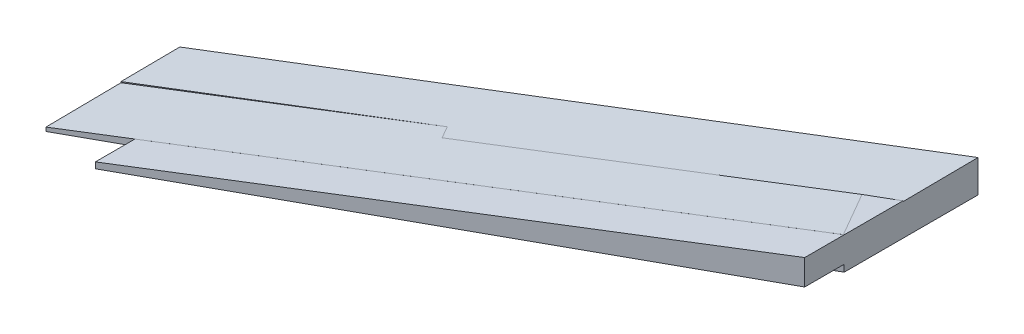
ISO-10303-21;
HEADER;
FILE_DESCRIPTION(('STEP AP214'),'2;1');
FILE_NAME('part.step','',(''),(''),'','','');
FILE_SCHEMA(('AUTOMOTIVE_DESIGN { 1 0 10303 214 1 1 1 1 }'));
ENDSEC;
DATA;
#1=APPLICATION_CONTEXT('core data for automotive mechanical design processes');
#2=APPLICATION_PROTOCOL_DEFINITION('international standard','automotive_design',2000,#1);
#3=PRODUCT_CONTEXT('',#1,'mechanical');
#4=PRODUCT('Part','Part','',(#3));
#5=PRODUCT_RELATED_PRODUCT_CATEGORY('part','',(#4));
#6=PRODUCT_DEFINITION_FORMATION('','',#4);
#7=PRODUCT_DEFINITION_CONTEXT('part definition',#1,'design');
#8=PRODUCT_DEFINITION('design','',#6,#7);
#9=PRODUCT_DEFINITION_SHAPE('','',#8);
#10=(LENGTH_UNIT() NAMED_UNIT(*) SI_UNIT(.MILLI.,.METRE.));
#11=(NAMED_UNIT(*) PLANE_ANGLE_UNIT() SI_UNIT($,.RADIAN.));
#12=(NAMED_UNIT(*) SI_UNIT($,.STERADIAN.) SOLID_ANGLE_UNIT());
#13=UNCERTAINTY_MEASURE_WITH_UNIT(LENGTH_MEASURE(1.E-05),#10,'distance_accuracy_value','');
#14=(GEOMETRIC_REPRESENTATION_CONTEXT(3) GLOBAL_UNCERTAINTY_ASSIGNED_CONTEXT((#13)) GLOBAL_UNIT_ASSIGNED_CONTEXT((#10,
#11,#12)) REPRESENTATION_CONTEXT('',''));
#15=CARTESIAN_POINT('',(0.,0.,0.));
#16=DIRECTION('',(0.,0.,1.));
#17=DIRECTION('',(1.,0.,0.));
#18=AXIS2_PLACEMENT_3D('',#15,#16,#17);
#19=CARTESIAN_POINT('',(-17157.6952997773,389.318894009088,14193.2592132526));
#20=DIRECTION('',(0.500000000000001,0.,0.866025403784438));
#21=DIRECTION('',(0.866025403784438,0.,-0.500000000000001));
#22=AXIS2_PLACEMENT_3D('',#19,#20,#21);
#23=PLANE('',#22);
#24=DIRECTION('',(0.865449530647156,0.036462033269615,-0.499667519489173));
#25=VECTOR('',#24,1.);
#26=CARTESIAN_POINT('',(-17116.5165476552,-913.886239330469,14169.48464963));
#27=LINE('',#26,#25);
#28=CARTESIAN_POINT('',(-4259.50817269094,-372.210901237541,6746.48740337114));
#29=VERTEX_POINT('',#28);
#30=CARTESIAN_POINT('',(-1123.39122511417,-240.083958613352,4935.84943947754));
#31=VERTEX_POINT('',#30);
#32=EDGE_CURVE('E220',#29,#31,#27,.T.);
#33=ORIENTED_EDGE('',*,*,#32,.F.);
#34=DIRECTION('',(0.866025403784438,0.,-0.500000000000001));
#35=VECTOR('',#34,1.);
#36=CARTESIAN_POINT('',(-17157.6952997773,-372.210901237541,14193.2592132526));
#37=LINE('',#36,#35);
#38=CARTESIAN_POINT('',(0.,-372.210901237541,4287.25921325261));
#39=VERTEX_POINT('',#38);
#40=EDGE_CURVE('E306',#29,#39,#37,.T.);
#41=ORIENTED_EDGE('',*,*,#40,.T.);
#42=DIRECTION('',(0.,-1.,0.));
#43=VECTOR('',#42,1.);
#44=CARTESIAN_POINT('',(0.,389.318894009088,4287.25921325261));
#45=LINE('',#44,#43);
#46=CARTESIAN_POINT('',(0.,-209.67853273297,4287.25921325261));
#47=VERTEX_POINT('',#46);
#48=EDGE_CURVE('E296',#47,#39,#45,.T.);
#49=ORIENTED_EDGE('',*,*,#48,.F.);
#50=DIRECTION('',(0.865787597616116,0.0234331905385812,-0.499862702544706));
#51=VECTOR('',#50,1.);
#52=CARTESIAN_POINT('',(-10555.6823901357,-495.375991779352,10381.5852826777));
#53=LINE('',#52,#51);
#54=EDGE_CURVE('E102',#31,#47,#53,.T.);
#55=ORIENTED_EDGE('',*,*,#54,.F.);
#56=EDGE_LOOP('',(#33,#41,#49,#55));
#57=FACE_BOUND('',#56,.T.);
#58=ADVANCED_FACE('F79',(#57),#23,.T.);
#59=CARTESIAN_POINT('',(-17157.6952997773,389.318894009089,11053.2235687628));
#60=DIRECTION('',(-0.500000000000001,0.,-0.866025403784438));
#61=DIRECTION('',(-0.866025403784438,0.,0.500000000000001));
#62=AXIS2_PLACEMENT_3D('',#59,#60,#61);
#63=PLANE('',#62);
#64=DIRECTION('',(0.865865507815104,-0.0192153541415936,-0.499907684019064));
#65=VECTOR('',#64,1.);
#66=CARTESIAN_POINT('',(-17157.6952997773,-8.55399638577419,11053.2235687628));
#67=LINE('',#66,#65);
#68=CARTESIAN_POINT('',(-11878.4044383073,-125.712426423717,8005.22356876278));
#69=VERTEX_POINT('',#68);
#70=CARTESIAN_POINT('',(-770.905430088806,-372.21090123754,1592.30602634428));
#71=VERTEX_POINT('',#70);
#72=EDGE_CURVE('E288',#69,#71,#67,.T.);
#73=ORIENTED_EDGE('',*,*,#72,.F.);
#74=DIRECTION('',(0.,-1.,0.));
#75=VECTOR('',#74,1.);
#76=CARTESIAN_POINT('',(-11878.4044383073,389.318894009089,8005.22356876278));
#77=LINE('',#76,#75);
#78=CARTESIAN_POINT('',(-11878.4044383073,125.712426423717,8005.22356876278));
#79=VERTEX_POINT('',#78);
#80=EDGE_CURVE('E248',#79,#69,#77,.T.);
#81=ORIENTED_EDGE('',*,*,#80,.F.);
#82=DIRECTION('',(-0.865865507815104,-0.0192153541415936,0.499907684019064));
#83=VECTOR('',#82,1.);
#84=CARTESIAN_POINT('',(-17157.6952997773,8.5539963857742,11053.2235687628));
#85=LINE('',#84,#83);
#86=CARTESIAN_POINT('',(1.11022302462516E-12,389.318894009089,1147.22356876276));
#87=VERTEX_POINT('',#86);
#88=EDGE_CURVE('E282',#87,#79,#85,.T.);
#89=ORIENTED_EDGE('',*,*,#88,.F.);
#90=DIRECTION('',(0.,1.,0.));
#91=VECTOR('',#90,1.);
#92=CARTESIAN_POINT('',(0.,389.318894009089,1147.22356876276));
#93=LINE('',#92,#91);
#94=CARTESIAN_POINT('',(0.,-372.21090123754,1147.22356876276));
#95=VERTEX_POINT('',#94);
#96=EDGE_CURVE('E285',#95,#87,#93,.T.);
#97=ORIENTED_EDGE('',*,*,#96,.F.);
#98=DIRECTION('',(0.866025403784438,0.,-0.500000000000001));
#99=VECTOR('',#98,1.);
#100=CARTESIAN_POINT('',(-17157.6952997773,-372.21090123754,11053.2235687628));
#101=LINE('',#100,#99);
#102=EDGE_CURVE('E303',#71,#95,#101,.T.);
#103=ORIENTED_EDGE('',*,*,#102,.F.);
#104=EDGE_LOOP('',(#73,#81,#89,#97,#103));
#105=FACE_BOUND('',#104,.T.);
#106=ADVANCED_FACE('F81',(#105),#63,.T.);
#107=DIRECTION('',(-0.865938611610236,0.0141572559740367,0.499949890514862));
#108=VECTOR('',#107,1.);
#109=CARTESIAN_POINT('',(-17161.680228594,64.3308941444504,14195.5599129777));
#110=LINE('',#109,#108);
#111=CARTESIAN_POINT('',(-10555.6823901357,-43.6707599093858,10381.5852826777));
#112=VERTEX_POINT('',#111);
#113=CARTESIAN_POINT('',(-11878.4044383073,-22.045538020219,11145.2592132526));
#114=VERTEX_POINT('',#113);
#115=EDGE_CURVE('E210',#112,#114,#110,.T.);
#116=ORIENTED_EDGE('',*,*,#115,.F.);
#117=DIRECTION('',(0.,1.,0.));
#118=VECTOR('',#117,1.);
#119=CARTESIAN_POINT('',(-10555.6823901357,-495.375991779352,10381.5852826777));
#120=LINE('',#119,#118);
#121=CARTESIAN_POINT('',(-10555.6823901357,103.621434962706,10381.5852826777));
#122=VERTEX_POINT('',#121);
#123=EDGE_CURVE('E234',#112,#122,#120,.T.);
#124=ORIENTED_EDGE('',*,*,#123,.T.);
#125=DIRECTION('',(0.865787597616116,0.0234331905385812,-0.499862702544706));
#126=VECTOR('',#125,1.);
#127=CARTESIAN_POINT('',(-10555.6823901357,103.621434962706,10381.5852826777));
#128=LINE('',#127,#126);
#129=CARTESIAN_POINT('',(0.,389.318894009088,4287.25921325261));
#130=VERTEX_POINT('',#129);
#131=EDGE_CURVE('E249',#122,#130,#128,.T.);
#132=ORIENTED_EDGE('',*,*,#131,.T.);
#133=DIRECTION('',(0.866025403784438,0.,-0.500000000000001));
#134=VECTOR('',#133,1.);
#135=CARTESIAN_POINT('',(-17157.6952997773,389.318894009088,14193.2592132526));
#136=LINE('',#135,#134);
#137=CARTESIAN_POINT('',(-12.6233714239905,389.318894009088,4294.54732014233));
#138=VERTEX_POINT('',#137);
#139=EDGE_CURVE('E302',#138,#130,#136,.T.);
#140=ORIENTED_EDGE('',*,*,#139,.F.);
#141=DIRECTION('',(0.865787597616116,0.0234331905385812,-0.499862702544706));
#142=VECTOR('',#141,1.);
#143=CARTESIAN_POINT('',(-15553.2970278185,-31.3010916443354,13266.9594390499));
#144=LINE('',#143,#142);
#145=CARTESIAN_POINT('',(-11878.4044383073,68.1626319016542,11145.2592132526));
#146=VERTEX_POINT('',#145);
#147=EDGE_CURVE('E263',#146,#138,#144,.T.);
#148=ORIENTED_EDGE('',*,*,#147,.F.);
#149=DIRECTION('',(0.,1.,0.));
#150=VECTOR('',#149,1.);
#151=CARTESIAN_POINT('',(-11878.4044383073,389.318894009089,11145.2592132526));
#152=LINE('',#151,#150);
#153=EDGE_CURVE('E254',#114,#146,#152,.T.);
#154=ORIENTED_EDGE('',*,*,#153,.F.);
#155=EDGE_LOOP('',(#116,#124,#132,#140,#148,#154));
#156=FACE_BOUND('',#155,.T.);
#157=ADVANCED_FACE('F329',(#156),#23,.T.);
#158=CARTESIAN_POINT('',(-16395.6952997773,8.5539963857742,12373.0462841303));
#159=DIRECTION('',(0.0166409848293346,-0.999815368038126,-0.00960767707079685));
#160=DIRECTION('',(0.999861516440926,0.0166417529260207,0.));
#161=AXIS2_PLACEMENT_3D('',#158,#159,#160);
#162=PLANE('',#161);
#163=DIRECTION('',(0.,0.00960900763753258,-0.999953832420388));
#164=VECTOR('',#163,1.);
#165=CARTESIAN_POINT('',(-11878.4044383073,83.7331046735021,12373.7687141088));
#166=LINE('',#165,#164);
#167=CARTESIAN_POINT('',(-11878.4044383073,112.4487696523,9385.49559276265));
#168=VERTEX_POINT('',#167);
#169=EDGE_CURVE('E258',#168,#79,#166,.T.);
#170=ORIENTED_EDGE('',*,*,#169,.F.);
#171=DIRECTION('',(0.865865507815105,0.0192153541415937,-0.499907684019064));
#172=VECTOR('',#171,1.);
#173=CARTESIAN_POINT('',(-16560.0199813189,8.5539963857742,12088.4275867627));
#174=LINE('',#173,#172);
#175=CARTESIAN_POINT('',(-7023.33152303197,220.192922304478,6582.41793819314));
#176=VERTEX_POINT('',#175);
#177=EDGE_CURVE('E276',#168,#176,#174,.T.);
#178=ORIENTED_EDGE('',*,*,#177,.T.);
#179=DIRECTION('',(0.500000000000002,0.,0.866025403784438));
#180=VECTOR('',#179,1.);
#181=CARTESIAN_POINT('',(-6859.00684149535,220.192922304356,6867.03663556357));
#182=LINE('',#181,#180);
#183=CARTESIAN_POINT('',(-6859.00684154281,220.192922303187,6867.03663559098));
#184=VERTEX_POINT('',#183);
#185=EDGE_CURVE('E273',#176,#184,#182,.T.);
#186=ORIENTED_EDGE('',*,*,#185,.T.);
#187=DIRECTION('',(-0.865865507815104,-0.0192153541415936,0.499907684019064));
#188=VECTOR('',#187,1.);
#189=CARTESIAN_POINT('',(-16395.6952997773,8.5539963857742,12373.0462841303));
#190=LINE('',#189,#188);
#191=CARTESIAN_POINT('',(0.,372.408531229028,2906.98718925274));
#192=VERTEX_POINT('',#191);
#193=EDGE_CURVE('E281',#192,#184,#190,.T.);
#194=ORIENTED_EDGE('',*,*,#193,.F.);
#195=DIRECTION('',(0.,-0.00960900763753258,0.999953832420388));
#196=VECTOR('',#195,1.);
#197=CARTESIAN_POINT('',(0.,400.306118114407,3.846722140163));
#198=LINE('',#197,#196);
#199=EDGE_CURVE('E311',#87,#192,#198,.T.);
#200=ORIENTED_EDGE('',*,*,#199,.F.);
#201=ORIENTED_EDGE('',*,*,#88,.T.);
#202=EDGE_LOOP('',(#170,#178,#186,#194,#200,#201));
#203=FACE_BOUND('',#202,.T.);
#204=ADVANCED_FACE('F351',(#203),#162,.F.);
#205=CARTESIAN_POINT('',(-16395.6952997773,-8.55399638577419,12373.0462841303));
#206=DIRECTION('',(0.0166409848293346,0.999815368038126,-0.00960767707079685));
#207=DIRECTION('',(-0.999861516440926,0.0166417529260207,0.));
#208=AXIS2_PLACEMENT_3D('',#205,#206,#207);
#209=PLANE('',#208);
#210=DIRECTION('',(0.865865507815104,-0.0192153541415936,-0.499907684019064));
#211=VECTOR('',#210,1.);
#212=CARTESIAN_POINT('',(-16395.6952997773,-8.55399638577419,12373.0462841303));
#213=LINE('',#212,#211);
#214=CARTESIAN_POINT('',(-3184.47452777852,-301.738426860844,4745.54441509318));
#215=VERTEX_POINT('',#214);
#216=CARTESIAN_POINT('',(-8.90543008879696,-372.21090123754,2912.12874171176));
#217=VERTEX_POINT('',#216);
#218=EDGE_CURVE('E278',#215,#217,#213,.T.);
#219=ORIENTED_EDGE('',*,*,#218,.F.);
#220=DIRECTION('',(-0.500000000000001,0.,-0.866025403784438));
#221=VECTOR('',#220,1.);
#222=CARTESIAN_POINT('',(-3184.47452777693,-301.738426860828,4745.54441509226));
#223=LINE('',#222,#221);
#224=CARTESIAN_POINT('',(-3251.90008959657,-301.738426860809,4628.75991628716));
#225=VERTEX_POINT('',#224);
#226=EDGE_CURVE('E227',#215,#225,#223,.T.);
#227=ORIENTED_EDGE('',*,*,#226,.T.);
#228=DIRECTION('',(0.865865507815105,-0.0192153541415936,-0.499907684019064));
#229=VECTOR('',#228,1.);
#230=CARTESIAN_POINT('',(-16463.1208615989,-8.55399638577419,12256.2617853263));
#231=LINE('',#230,#229);
#232=CARTESIAN_POINT('',(-11878.4044383073,-110.298376912756,9609.27452418082));
#233=VERTEX_POINT('',#232);
#234=EDGE_CURVE('E204',#233,#225,#231,.T.);
#235=ORIENTED_EDGE('',*,*,#234,.F.);
#236=DIRECTION('',(0.,0.00960900763753258,0.999953832420388));
#237=VECTOR('',#236,1.);
#238=CARTESIAN_POINT('',(-11878.4044383073,-83.7331046735021,12373.7687141088));
#239=LINE('',#238,#237);
#240=EDGE_CURVE('E260',#69,#233,#239,.T.);
#241=ORIENTED_EDGE('',*,*,#240,.F.);
#242=ORIENTED_EDGE('',*,*,#72,.T.);
#243=DIRECTION('',(0.500000000000008,0.,0.866025403784434));
#244=VECTOR('',#243,1.);
#245=CARTESIAN_POINT('',(-770.905430088867,-372.21090123754,1592.30602634415));
#246=LINE('',#245,#244);
#247=EDGE_CURVE('E317',#71,#217,#246,.T.);
#248=ORIENTED_EDGE('',*,*,#247,.T.);
#249=EDGE_LOOP('',(#219,#227,#235,#241,#242,#248));
#250=FACE_BOUND('',#249,.T.);
#251=ADVANCED_FACE('F373',(#250),#209,.F.);
#252=CARTESIAN_POINT('',(1258.7623771844,0.,2180.24039193955));
#253=DIRECTION('',(0.500000000000001,0.,0.866025403784438));
#254=DIRECTION('',(0.866025403784438,0.,-0.500000000000001));
#255=AXIS2_PLACEMENT_3D('',#252,#253,#254);
#256=PLANE('',#255);
#257=DIRECTION('',(-0.866025403784438,0.,0.500000000000001));
#258=VECTOR('',#257,1.);
#259=CARTESIAN_POINT('',(-16395.6952997773,-372.21090123754,12373.0462841303));
#260=LINE('',#259,#258);
#261=CARTESIAN_POINT('',(-4857.18349114936,-372.21090123754,5711.28338537124));
#262=VERTEX_POINT('',#261);
#263=EDGE_CURVE('E314',#217,#262,#260,.T.);
#264=ORIENTED_EDGE('',*,*,#263,.T.);
#265=DIRECTION('',(0.865449530647156,0.036462033269615,-0.499667519489173));
#266=VECTOR('',#265,1.);
#267=CARTESIAN_POINT('',(1262.37685591903,-114.3892662736,2178.15357166914));
#268=LINE('',#267,#266);
#269=EDGE_CURVE('E224',#262,#215,#268,.T.);
#270=ORIENTED_EDGE('',*,*,#269,.T.);
#271=ORIENTED_EDGE('',*,*,#218,.T.);
#272=EDGE_LOOP('',(#264,#270,#271));
#273=FACE_BOUND('',#272,.T.);
#274=ADVANCED_FACE('F365',(#273),#256,.F.);
#275=CARTESIAN_POINT('',(1094.43769564283,0.,1895.62169457197));
#276=DIRECTION('',(-0.500000000000001,0.,-0.866025403784438));
#277=DIRECTION('',(-0.866025403784438,0.,0.500000000000001));
#278=AXIS2_PLACEMENT_3D('',#275,#276,#277);
#279=PLANE('',#278);
#280=DIRECTION('',(0.,1.,0.));
#281=VECTOR('',#280,1.);
#282=CARTESIAN_POINT('',(-11878.4044383073,0.,9385.49559276265));
#283=LINE('',#282,#281);
#284=CARTESIAN_POINT('',(-11878.4044383073,88.7867332858325,9385.49559276265));
#285=VERTEX_POINT('',#284);
#286=EDGE_CURVE('E256',#285,#168,#283,.T.);
#287=ORIENTED_EDGE('',*,*,#286,.F.);
#288=DIRECTION('',(0.865787597616116,0.0234331905385812,-0.499862702544706));
#289=VECTOR('',#288,1.);
#290=CARTESIAN_POINT('',(-16315.2970278185,-31.3010916443354,11947.1367236824));
#291=LINE('',#290,#289);
#292=EDGE_CURVE('E264',#285,#176,#291,.T.);
#293=ORIENTED_EDGE('',*,*,#292,.T.);
#294=ORIENTED_EDGE('',*,*,#177,.F.);
#295=EDGE_LOOP('',(#287,#293,#294));
#296=FACE_BOUND('',#295,.T.);
#297=ADVANCED_FACE('F363',(#296),#279,.F.);
#298=CARTESIAN_POINT('',(-16315.2970278185,-31.3010916443354,11947.1367236824));
#299=DIRECTION('',(0.0202937382981324,-0.999725405089409,-0.0117165952692906));
#300=DIRECTION('',(0.999794032609656,0.0202951313896042,0.));
#301=AXIS2_PLACEMENT_3D('',#298,#299,#300);
#302=PLANE('',#301);
#303=DIRECTION('',(0.,0.011719008671536,-0.999931330060098));
#304=VECTOR('',#303,1.);
#305=CARTESIAN_POINT('',(-11878.4044383073,58.75240784242,11948.1921338987));
#306=LINE('',#305,#304);
#307=EDGE_CURVE('E320',#146,#285,#306,.T.);
#308=ORIENTED_EDGE('',*,*,#307,.F.);
#309=ORIENTED_EDGE('',*,*,#147,.T.);
#310=DIRECTION('',(0.500000000000001,0.,0.866025403784438));
#311=VECTOR('',#310,1.);
#312=CARTESIAN_POINT('',(-774.623371423993,389.318894009088,2974.72460477485));
#313=LINE('',#312,#311);
#314=CARTESIAN_POINT('',(-610.298689882333,389.31889400909,3259.34330214238));
#315=VERTEX_POINT('',#314);
#316=EDGE_CURVE('E267',#315,#138,#313,.T.);
#317=ORIENTED_EDGE('',*,*,#316,.F.);
#318=DIRECTION('',(-0.865787597616116,-0.0234331905385812,0.499862702544706));
#319=VECTOR('',#318,1.);
#320=CARTESIAN_POINT('',(1249.83748255511,439.664874335504,2185.39318225626));
#321=LINE('',#320,#319);
#322=EDGE_CURVE('E271',#315,#184,#321,.T.);
#323=ORIENTED_EDGE('',*,*,#322,.T.);
#324=ORIENTED_EDGE('',*,*,#185,.F.);
#325=ORIENTED_EDGE('',*,*,#292,.F.);
#326=EDGE_LOOP('',(#308,#309,#317,#323,#324,#325));
#327=FACE_BOUND('',#326,.T.);
#328=ADVANCED_FACE('F358',(#327),#302,.F.);
#329=CARTESIAN_POINT('',(-17157.6952997773,-372.21090123754,11053.2235687628));
#330=DIRECTION('',(0.,-1.,0.));
#331=DIRECTION('',(0.,0.,-1.));
#332=AXIS2_PLACEMENT_3D('',#329,#330,#331);
#333=PLANE('',#332);
#334=DIRECTION('',(0.499999999999998,0.,0.86602540378444));
#335=VECTOR('',#334,1.);
#336=CARTESIAN_POINT('',(-5619.18349114933,-372.21090123754,4391.4606700038));
#337=LINE('',#336,#335);
#338=EDGE_CURVE('E222',#262,#29,#337,.T.);
#339=ORIENTED_EDGE('',*,*,#338,.F.);
#340=ORIENTED_EDGE('',*,*,#263,.F.);
#341=ORIENTED_EDGE('',*,*,#247,.F.);
#342=ORIENTED_EDGE('',*,*,#102,.T.);
#343=DIRECTION('',(0.,0.,-1.));
#344=VECTOR('',#343,1.);
#345=CARTESIAN_POINT('',(0.,-372.21090123754,1147.22356876276));
#346=LINE('',#345,#344);
#347=EDGE_CURVE('E299',#39,#95,#346,.T.);
#348=ORIENTED_EDGE('',*,*,#347,.F.);
#349=ORIENTED_EDGE('',*,*,#40,.F.);
#350=EDGE_LOOP('',(#339,#340,#341,#342,#348,#349));
#351=FACE_BOUND('',#350,.T.);
#352=ADVANCED_FACE('F371',(#351),#333,.T.);
#353=CARTESIAN_POINT('',(-17157.6952997773,389.318894009089,11053.2235687628));
#354=DIRECTION('',(0.,1.,0.));
#355=DIRECTION('',(0.,0.,1.));
#356=AXIS2_PLACEMENT_3D('',#353,#354,#355);
#357=PLANE('',#356);
#358=ORIENTED_EDGE('',*,*,#316,.T.);
#359=ORIENTED_EDGE('',*,*,#139,.T.);
#360=DIRECTION('',(0.,0.,1.));
#361=VECTOR('',#360,1.);
#362=CARTESIAN_POINT('',(0.,389.318894009089,1147.22356876276));
#363=LINE('',#362,#361);
#364=CARTESIAN_POINT('',(0.,389.318894009088,2906.98718925274));
#365=VERTEX_POINT('',#364);
#366=EDGE_CURVE('E293',#365,#130,#363,.T.);
#367=ORIENTED_EDGE('',*,*,#366,.F.);
#368=DIRECTION('',(0.866025403784438,0.,-0.500000000000001));
#369=VECTOR('',#368,1.);
#370=CARTESIAN_POINT('',(762.000000000003,389.318894009089,2467.04628413024));
#371=LINE('',#370,#369);
#372=EDGE_CURVE('E279',#315,#365,#371,.T.);
#373=ORIENTED_EDGE('',*,*,#372,.F.);
#374=EDGE_LOOP('',(#358,#359,#367,#373));
#375=FACE_BOUND('',#374,.T.);
#376=ADVANCED_FACE('F340',(#375),#357,.T.);
#377=CARTESIAN_POINT('',(0.,0.,0.));
#378=DIRECTION('',(-1.,0.,0.));
#379=DIRECTION('',(0.,0.,1.));
#380=AXIS2_PLACEMENT_3D('',#377,#378,#379);
#381=PLANE('',#380);
#382=ORIENTED_EDGE('',*,*,#96,.T.);
#383=ORIENTED_EDGE('',*,*,#199,.T.);
#384=DIRECTION('',(0.,-1.,0.));
#385=VECTOR('',#384,1.);
#386=CARTESIAN_POINT('',(0.,0.,2906.98718925274));
#387=LINE('',#386,#385);
#388=EDGE_CURVE('E305',#365,#192,#387,.T.);
#389=ORIENTED_EDGE('',*,*,#388,.F.);
#390=ORIENTED_EDGE('',*,*,#366,.T.);
#391=DIRECTION('',(0.,0.,1.));
#392=VECTOR('',#391,1.);
#393=CARTESIAN_POINT('',(0.,389.318894009088,5214.94359286677));
#394=LINE('',#393,#392);
#395=CARTESIAN_POINT('',(0.,389.318894009088,5214.94359286677));
#396=VERTEX_POINT('',#395);
#397=EDGE_CURVE('E235',#130,#396,#394,.T.);
#398=ORIENTED_EDGE('',*,*,#397,.T.);
#399=DIRECTION('',(0.,-1.,0.));
#400=VECTOR('',#399,1.);
#401=CARTESIAN_POINT('',(0.,-209.67853273297,5214.94359286677));
#402=LINE('',#401,#400);
#403=CARTESIAN_POINT('',(1.77635683940025E-12,-209.67853273297,5214.94359286677));
#404=VERTEX_POINT('',#403);
#405=EDGE_CURVE('E230',#396,#404,#402,.T.);
#406=ORIENTED_EDGE('',*,*,#405,.T.);
#407=DIRECTION('',(0.,0.,-1.));
#408=VECTOR('',#407,1.);
#409=CARTESIAN_POINT('',(0.,-209.67853273297,5214.94359286677));
#410=LINE('',#409,#408);
#411=EDGE_CURVE('E242',#404,#47,#410,.T.);
#412=ORIENTED_EDGE('',*,*,#411,.T.);
#413=ORIENTED_EDGE('',*,*,#48,.T.);
#414=ORIENTED_EDGE('',*,*,#347,.T.);
#415=EDGE_LOOP('',(#382,#383,#389,#390,#398,#406,#412,#413,#414));
#416=FACE_BOUND('',#415,.T.);
#417=ADVANCED_FACE('F344',(#416),#381,.F.);
#418=CARTESIAN_POINT('',(1258.7623771844,0.,2180.24039193955));
#419=DIRECTION('',(-0.500000000000001,0.,-0.866025403784438));
#420=DIRECTION('',(-0.866025403784438,0.,0.500000000000001));
#421=AXIS2_PLACEMENT_3D('',#418,#419,#420);
#422=PLANE('',#421);
#423=ORIENTED_EDGE('',*,*,#322,.F.);
#424=ORIENTED_EDGE('',*,*,#372,.T.);
#425=ORIENTED_EDGE('',*,*,#388,.T.);
#426=ORIENTED_EDGE('',*,*,#193,.T.);
#427=EDGE_LOOP('',(#423,#424,#425,#426));
#428=FACE_BOUND('',#427,.T.);
#429=ADVANCED_FACE('F348',(#428),#422,.T.);
#430=CARTESIAN_POINT('',(-11878.4044383073,0.,-3048.00000000001));
#431=DIRECTION('',(-1.,0.,0.));
#432=DIRECTION('',(0.,0.,1.));
#433=AXIS2_PLACEMENT_3D('',#430,#431,#432);
#434=PLANE('',#433);
#435=DIRECTION('',(0.,-0.00707916007995231,-0.99997494243234));
#436=VECTOR('',#435,1.);
#437=CARTESIAN_POINT('',(-11878.4044383073,-122.518269552774,-3047.13265182349));
#438=LINE('',#437,#436);
#439=CARTESIAN_POINT('',(-11878.4044383073,-32.9192919843398,9609.27452418082));
#440=VERTEX_POINT('',#439);
#441=EDGE_CURVE('E214',#114,#440,#438,.T.);
#442=ORIENTED_EDGE('',*,*,#441,.F.);
#443=ORIENTED_EDGE('',*,*,#153,.T.);
#444=ORIENTED_EDGE('',*,*,#307,.T.);
#445=ORIENTED_EDGE('',*,*,#286,.T.);
#446=ORIENTED_EDGE('',*,*,#169,.T.);
#447=ORIENTED_EDGE('',*,*,#80,.T.);
#448=ORIENTED_EDGE('',*,*,#240,.T.);
#449=DIRECTION('',(0.,1.,0.));
#450=VECTOR('',#449,1.);
#451=CARTESIAN_POINT('',(-11878.4044383073,2.48329556207132E-11,9609.27452418082));
#452=LINE('',#451,#450);
#453=EDGE_CURVE('E13',#233,#440,#452,.T.);
#454=ORIENTED_EDGE('',*,*,#453,.T.);
#455=EDGE_LOOP('',(#442,#443,#444,#445,#446,#447,#448,#454));
#456=FACE_BOUND('',#455,.T.);
#457=ADVANCED_FACE('F361',(#456),#434,.T.);
#458=CARTESIAN_POINT('',(-10555.6823901357,-495.375991779352,11309.2696622918));
#459=DIRECTION('',(0.500000000000001,0.,0.866025403784438));
#460=DIRECTION('',(0.866025403784438,0.,-0.500000000000001));
#461=AXIS2_PLACEMENT_3D('',#458,#459,#460);
#462=PLANE('',#461);
#463=DIRECTION('',(-0.865938611610236,0.0141572559740367,0.499949890514862));
#464=VECTOR('',#463,1.);
#465=CARTESIAN_POINT('',(1.77635683940025E-12,-209.67853273297,5214.94359286677));
#466=LINE('',#465,#464);
#467=CARTESIAN_POINT('',(-10555.6823901357,-37.1033691195868,11309.2696622918));
#468=VERTEX_POINT('',#467);
#469=EDGE_CURVE('E94',#404,#468,#466,.T.);
#470=ORIENTED_EDGE('',*,*,#469,.F.);
#471=ORIENTED_EDGE('',*,*,#405,.F.);
#472=DIRECTION('',(0.865787597616116,0.0234331905385812,-0.499862702544706));
#473=VECTOR('',#472,1.);
#474=CARTESIAN_POINT('',(-10555.6823901357,103.621434962706,11309.2696622918));
#475=LINE('',#474,#473);
#476=CARTESIAN_POINT('',(-10555.6823901357,103.621434962706,11309.2696622918));
#477=VERTEX_POINT('',#476);
#478=EDGE_CURVE('E246',#477,#396,#475,.T.);
#479=ORIENTED_EDGE('',*,*,#478,.F.);
#480=DIRECTION('',(0.,-1.,0.));
#481=VECTOR('',#480,1.);
#482=CARTESIAN_POINT('',(-10555.6823901357,-495.375991779352,11309.2696622918));
#483=LINE('',#482,#481);
#484=EDGE_CURVE('E231',#477,#468,#483,.T.);
#485=ORIENTED_EDGE('',*,*,#484,.T.);
#486=EDGE_LOOP('',(#470,#471,#479,#485));
#487=FACE_BOUND('',#486,.T.);
#488=ADVANCED_FACE('F418',(#487),#462,.T.);
#489=CARTESIAN_POINT('',(-10555.6823901357,103.621434962706,11309.2696622918));
#490=DIRECTION('',(-0.0270558417186725,0.999633923708521,0.));
#491=DIRECTION('',(-0.999633923708522,-0.0270558417186725,0.));
#492=AXIS2_PLACEMENT_3D('',#489,#490,#491);
#493=PLANE('',#492);
#494=ORIENTED_EDGE('',*,*,#397,.F.);
#495=ORIENTED_EDGE('',*,*,#131,.F.);
#496=DIRECTION('',(0.,0.,1.));
#497=VECTOR('',#496,1.);
#498=CARTESIAN_POINT('',(-10555.6823901357,103.621434962706,11309.2696622918));
#499=LINE('',#498,#497);
#500=EDGE_CURVE('E237',#122,#477,#499,.T.);
#501=ORIENTED_EDGE('',*,*,#500,.T.);
#502=ORIENTED_EDGE('',*,*,#478,.T.);
#503=EDGE_LOOP('',(#494,#495,#501,#502));
#504=FACE_BOUND('',#503,.T.);
#505=ADVANCED_FACE('F335',(#504),#493,.T.);
#506=CARTESIAN_POINT('',(-10555.6823901357,-495.375991779352,11309.2696622918));
#507=DIRECTION('',(0.0270558417186725,-0.999633923708521,0.));
#508=DIRECTION('',(0.999633923708522,0.0270558417186725,0.));
#509=AXIS2_PLACEMENT_3D('',#506,#507,#508);
#510=PLANE('',#509);
#511=DIRECTION('',(0.970163285053343,0.0262581967849705,0.241026362533454));
#512=VECTOR('',#511,1.);
#513=CARTESIAN_POINT('',(-8517.39736999473,-440.208279305286,3098.89020477245));
#514=LINE('',#513,#512);
#515=EDGE_CURVE('E87',#31,#404,#514,.T.);
#516=ORIENTED_EDGE('',*,*,#515,.F.);
#517=ORIENTED_EDGE('',*,*,#54,.T.);
#518=ORIENTED_EDGE('',*,*,#411,.F.);
#519=EDGE_LOOP('',(#516,#517,#518));
#520=FACE_BOUND('',#519,.T.);
#521=ADVANCED_FACE('F416',(#520),#510,.T.);
#522=CARTESIAN_POINT('',(-10555.6823901357,-285.697459046382,6094.32606942505));
#523=DIRECTION('',(-1.,0.,0.));
#524=DIRECTION('',(0.,0.,1.));
#525=AXIS2_PLACEMENT_3D('',#522,#523,#524);
#526=PLANE('',#525);
#527=DIRECTION('',(0.,-0.00707916007995231,-0.99997494243234));
#528=VECTOR('',#527,1.);
#529=CARTESIAN_POINT('',(-10555.6823901357,-74.0323227310189,6092.82762049425));
#530=LINE('',#529,#528);
#531=EDGE_CURVE('E322',#468,#112,#530,.T.);
#532=ORIENTED_EDGE('',*,*,#531,.F.);
#533=ORIENTED_EDGE('',*,*,#484,.F.);
#534=ORIENTED_EDGE('',*,*,#500,.F.);
#535=ORIENTED_EDGE('',*,*,#123,.F.);
#536=EDGE_LOOP('',(#532,#533,#534,#535));
#537=FACE_BOUND('',#536,.T.);
#538=ADVANCED_FACE('F333',(#537),#526,.T.);
#539=CARTESIAN_POINT('',(1191.33681536276,7.67359883986742E-12,2063.45589313559));
#540=DIRECTION('',(0.500000000000001,0.,0.866025403784438));
#541=DIRECTION('',(0.866025403784438,0.,-0.500000000000001));
#542=AXIS2_PLACEMENT_3D('',#539,#540,#541);
#543=PLANE('',#542);
#544=ORIENTED_EDGE('',*,*,#234,.T.);
#545=DIRECTION('',(0.865449530647156,0.036462033269615,-0.499667519489173));
#546=VECTOR('',#545,1.);
#547=CARTESIAN_POINT('',(-1066.8,-209.67853273297,3367.1917913523));
#548=LINE('',#547,#546);
#549=CARTESIAN_POINT('',(-1066.8,-209.67853273297,3367.1917913523));
#550=VERTEX_POINT('',#549);
#551=EDGE_CURVE('E198',#225,#550,#548,.T.);
#552=ORIENTED_EDGE('',*,*,#551,.T.);
#553=DIRECTION('',(-0.865938611610236,0.0141572559740367,0.499949890514862));
#554=VECTOR('',#553,1.);
#555=CARTESIAN_POINT('',(-1066.8,-209.67853273297,3367.1917913523));
#556=LINE('',#555,#554);
#557=EDGE_CURVE('E202',#550,#440,#556,.T.);
#558=ORIENTED_EDGE('',*,*,#557,.T.);
#559=ORIENTED_EDGE('',*,*,#453,.F.);
#560=EDGE_LOOP('',(#544,#552,#558,#559));
#561=FACE_BOUND('',#560,.T.);
#562=ADVANCED_FACE('F200',(#561),#543,.T.);
#563=CARTESIAN_POINT('',(-1066.8,-209.67853273297,3367.1917913523));
#564=DIRECTION('',(0.0315770470851199,-0.999335038978343,-0.0182310166348075));
#565=DIRECTION('',(0.999501154865671,0.0315822960246559,0.));
#566=AXIS2_PLACEMENT_3D('',#563,#564,#565);
#567=PLANE('',#566);
#568=ORIENTED_EDGE('',*,*,#269,.F.);
#569=ORIENTED_EDGE('',*,*,#338,.T.);
#570=ORIENTED_EDGE('',*,*,#32,.T.);
#571=ORIENTED_EDGE('',*,*,#515,.T.);
#572=DIRECTION('',(0.500000000000001,0.,0.866025403784438));
#573=VECTOR('',#572,1.);
#574=CARTESIAN_POINT('',(-1066.8,-209.67853273297,3367.1917913523));
#575=LINE('',#574,#573);
#576=EDGE_CURVE('E207',#550,#404,#575,.T.);
#577=ORIENTED_EDGE('',*,*,#576,.F.);
#578=ORIENTED_EDGE('',*,*,#551,.F.);
#579=ORIENTED_EDGE('',*,*,#226,.F.);
#580=EDGE_LOOP('',(#568,#569,#570,#571,#577,#578,#579));
#581=FACE_BOUND('',#580,.T.);
#582=ADVANCED_FACE('F209',(#581),#567,.F.);
#583=CARTESIAN_POINT('',(-1066.8,-209.67853273297,3367.1917913523));
#584=DIRECTION('',(0.0122605433213948,0.999899781029722,-0.00707862798701838));
#585=DIRECTION('',(-0.999924832947437,0.0122608505023026,0.));
#586=AXIS2_PLACEMENT_3D('',#583,#584,#585);
#587=PLANE('',#586);
#588=ORIENTED_EDGE('',*,*,#441,.T.);
#589=ORIENTED_EDGE('',*,*,#557,.F.);
#590=ORIENTED_EDGE('',*,*,#576,.T.);
#591=ORIENTED_EDGE('',*,*,#469,.T.);
#592=ORIENTED_EDGE('',*,*,#531,.T.);
#593=ORIENTED_EDGE('',*,*,#115,.T.);
#594=EDGE_LOOP('',(#588,#589,#590,#591,#592,#593));
#595=FACE_BOUND('',#594,.T.);
#596=ADVANCED_FACE('F212',(#595),#587,.F.);
#597=CLOSED_SHELL('',(#58,#106,#157,#204,#251,#274,#297,#328,#352,#376,#417,#429,#457,#488,#505,
#521,#538,#562,#582,#596));
#598=MANIFOLD_SOLID_BREP('B2',#597);
#599=ADVANCED_BREP_SHAPE_REPRESENTATION('',(#18,#598),#14);
#600=SHAPE_DEFINITION_REPRESENTATION(#9,#599);
ENDSEC;
END-ISO-10303-21;
